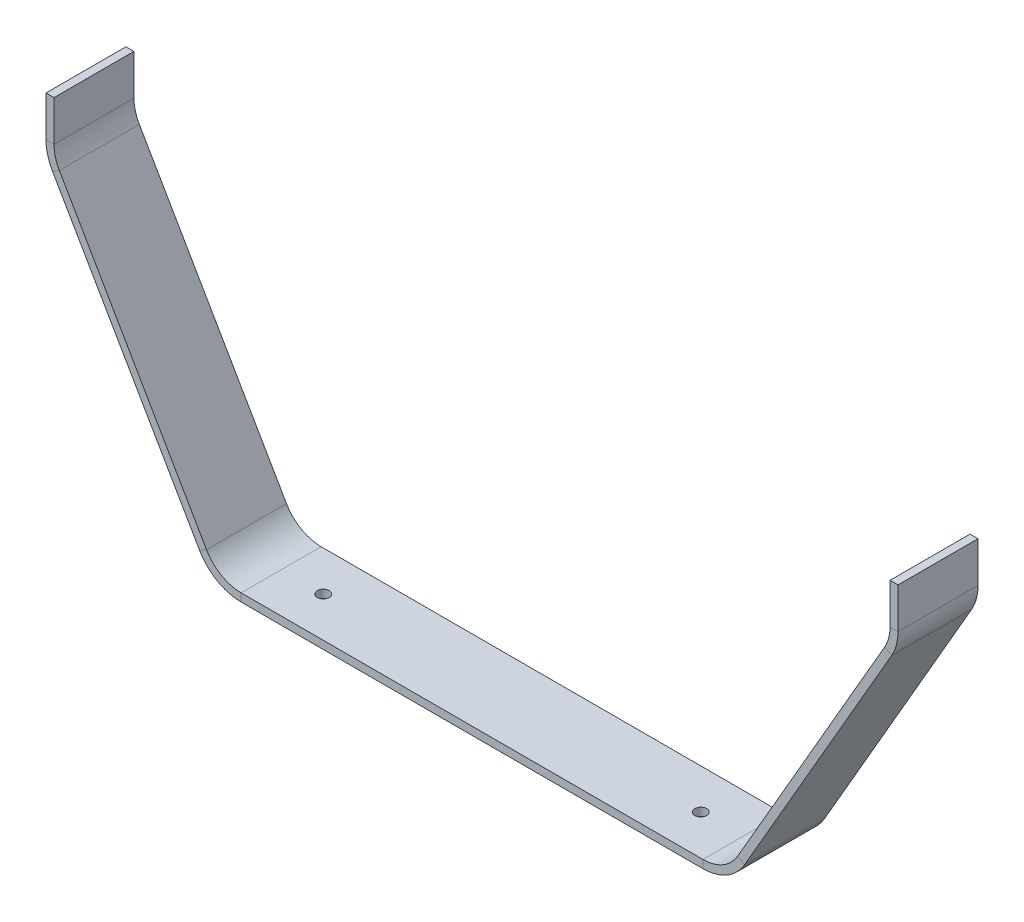
ISO-10303-21;
HEADER;
FILE_DESCRIPTION(('STEP AP214'),'2;1');
FILE_NAME('part.step','',(''),(''),'','','');
FILE_SCHEMA(('AUTOMOTIVE_DESIGN { 1 0 10303 214 1 1 1 1 }'));
ENDSEC;
DATA;
#1=APPLICATION_CONTEXT('core data for automotive mechanical design processes');
#2=APPLICATION_PROTOCOL_DEFINITION('international standard','automotive_design',2000,#1);
#3=PRODUCT_CONTEXT('',#1,'mechanical');
#4=PRODUCT('Part','Part','',(#3));
#5=PRODUCT_RELATED_PRODUCT_CATEGORY('part','',(#4));
#6=PRODUCT_DEFINITION_FORMATION('','',#4);
#7=PRODUCT_DEFINITION_CONTEXT('part definition',#1,'design');
#8=PRODUCT_DEFINITION('design','',#6,#7);
#9=PRODUCT_DEFINITION_SHAPE('','',#8);
#10=(LENGTH_UNIT() NAMED_UNIT(*) SI_UNIT(.MILLI.,.METRE.));
#11=(NAMED_UNIT(*) PLANE_ANGLE_UNIT() SI_UNIT($,.RADIAN.));
#12=(NAMED_UNIT(*) SI_UNIT($,.STERADIAN.) SOLID_ANGLE_UNIT());
#13=UNCERTAINTY_MEASURE_WITH_UNIT(LENGTH_MEASURE(1.E-05),#10,'distance_accuracy_value','');
#14=(GEOMETRIC_REPRESENTATION_CONTEXT(3) GLOBAL_UNCERTAINTY_ASSIGNED_CONTEXT((#13)) GLOBAL_UNIT_ASSIGNED_CONTEXT((#10,
#11,#12)) REPRESENTATION_CONTEXT('',''));
#15=CARTESIAN_POINT('',(0.,0.,0.));
#16=DIRECTION('',(0.,0.,1.));
#17=DIRECTION('',(1.,0.,0.));
#18=AXIS2_PLACEMENT_3D('',#15,#16,#17);
#19=CARTESIAN_POINT('',(33.5029250480415,-55.9805613919561,0.));
#20=DIRECTION('',(0.86602540378444,-0.499999999999998,0.));
#21=DIRECTION('',(0.,0.,-1.));
#22=AXIS2_PLACEMENT_3D('',#19,#20,#21);
#23=PLANE('',#22);
#24=DIRECTION('',(-0.499999999999998,-0.86602540378444,0.));
#25=VECTOR('',#24,1.);
#26=CARTESIAN_POINT('',(112.877925048041,81.5009714588238,-10.));
#27=LINE('',#26,#25);
#28=CARTESIAN_POINT('',(104.938028415146,67.7486670838041,-10.));
#29=VERTEX_POINT('',#28);
#30=CARTESIAN_POINT('',(68.132718313832,4.00000000000002,-10.));
#31=VERTEX_POINT('',#30);
#32=EDGE_CURVE('E56',#29,#31,#27,.T.);
#33=ORIENTED_EDGE('',*,*,#32,.F.);
#34=DIRECTION('',(0.,0.,1.));
#35=VECTOR('',#34,1.);
#36=CARTESIAN_POINT('',(104.938028415146,67.7486670838041,0.));
#37=LINE('',#36,#35);
#38=CARTESIAN_POINT('',(104.938028415146,67.7486670838041,9.99999999999997));
#39=VERTEX_POINT('',#38);
#40=EDGE_CURVE('E376',#29,#39,#37,.T.);
#41=ORIENTED_EDGE('',*,*,#40,.T.);
#42=DIRECTION('',(0.499999999999998,0.86602540378444,0.));
#43=VECTOR('',#42,1.);
#44=CARTESIAN_POINT('',(112.877925048041,81.5009714588238,9.99999999999998));
#45=LINE('',#44,#43);
#46=CARTESIAN_POINT('',(68.132718313832,4.00000000000005,9.99999999999999));
#47=VERTEX_POINT('',#46);
#48=EDGE_CURVE('E303',#47,#39,#45,.T.);
#49=ORIENTED_EDGE('',*,*,#48,.F.);
#50=DIRECTION('',(0.,0.,1.));
#51=VECTOR('',#50,1.);
#52=CARTESIAN_POINT('',(68.132718313832,4.,0.));
#53=LINE('',#52,#51);
#54=EDGE_CURVE('E274',#31,#47,#53,.T.);
#55=ORIENTED_EDGE('',*,*,#54,.F.);
#56=EDGE_LOOP('',(#33,#41,#49,#55));
#57=FACE_BOUND('',#56,.T.);
#58=ADVANCED_FACE('F52',(#57),#23,.T.);
#59=CARTESIAN_POINT('',(112.877925048041,81.5009714588238,-10.));
#60=DIRECTION('',(0.,0.,-1.));
#61=DIRECTION('',(-0.499999999999998,-0.86602540378444,0.));
#62=AXIS2_PLACEMENT_3D('',#59,#60,#61);
#63=PLANE('',#62);
#64=DIRECTION('',(-0.499999999999998,-0.86602540378444,0.));
#65=VECTOR('',#64,1.);
#66=CARTESIAN_POINT('',(111.145874240472,82.5009714588238,-10.));
#67=LINE('',#66,#65);
#68=CARTESIAN_POINT('',(103.205977607577,68.7486670838041,-10.));
#69=VERTEX_POINT('',#68);
#70=CARTESIAN_POINT('',(66.4006675062631,5.00000000000002,-10.));
#71=VERTEX_POINT('',#70);
#72=EDGE_CURVE('E283',#69,#71,#67,.T.);
#73=ORIENTED_EDGE('',*,*,#72,.F.);
#74=DIRECTION('',(0.86602540378444,-0.499999999999998,0.));
#75=VECTOR('',#74,1.);
#76=CARTESIAN_POINT('',(104.938028415146,67.7486670838041,-10.));
#77=LINE('',#76,#75);
#78=EDGE_CURVE('E383',#69,#29,#77,.T.);
#79=ORIENTED_EDGE('',*,*,#78,.T.);
#80=ORIENTED_EDGE('',*,*,#32,.T.);
#81=DIRECTION('',(0.86602540378444,-0.499999999999998,0.));
#82=VECTOR('',#81,1.);
#83=CARTESIAN_POINT('',(68.132718313832,4.,-10.));
#84=LINE('',#83,#82);
#85=EDGE_CURVE('E284',#71,#31,#84,.T.);
#86=ORIENTED_EDGE('',*,*,#85,.F.);
#87=EDGE_LOOP('',(#73,#79,#80,#86));
#88=FACE_BOUND('',#87,.T.);
#89=ADVANCED_FACE('F397',(#88),#63,.T.);
#90=CARTESIAN_POINT('',(112.877925048041,81.5009714588238,9.99999999999998));
#91=DIRECTION('',(0.,0.,1.));
#92=DIRECTION('',(0.499999999999998,0.86602540378444,0.));
#93=AXIS2_PLACEMENT_3D('',#90,#91,#92);
#94=PLANE('',#93);
#95=ORIENTED_EDGE('',*,*,#48,.T.);
#96=DIRECTION('',(-0.86602540378444,0.499999999999998,0.));
#97=VECTOR('',#96,1.);
#98=CARTESIAN_POINT('',(104.938028415146,67.7486670838041,9.99999999999998));
#99=LINE('',#98,#97);
#100=CARTESIAN_POINT('',(103.205977607577,68.7486670838041,9.99999999999998));
#101=VERTEX_POINT('',#100);
#102=EDGE_CURVE('E12',#39,#101,#99,.T.);
#103=ORIENTED_EDGE('',*,*,#102,.T.);
#104=DIRECTION('',(0.499999999999998,0.86602540378444,0.));
#105=VECTOR('',#104,1.);
#106=CARTESIAN_POINT('',(111.145874240472,82.5009714588238,9.99999999999998));
#107=LINE('',#106,#105);
#108=CARTESIAN_POINT('',(66.4006675062631,5.00000000000002,9.99999999999999));
#109=VERTEX_POINT('',#108);
#110=EDGE_CURVE('E282',#109,#101,#107,.T.);
#111=ORIENTED_EDGE('',*,*,#110,.F.);
#112=DIRECTION('',(-0.86602540378444,0.499999999999998,0.));
#113=VECTOR('',#112,1.);
#114=CARTESIAN_POINT('',(68.132718313832,4.,9.99999999999999));
#115=LINE('',#114,#113);
#116=EDGE_CURVE('E287',#47,#109,#115,.T.);
#117=ORIENTED_EDGE('',*,*,#116,.F.);
#118=EDGE_LOOP('',(#95,#103,#111,#117));
#119=FACE_BOUND('',#118,.T.);
#120=ADVANCED_FACE('F54',(#119),#94,.T.);
#121=CARTESIAN_POINT('',(-31.7708742404726,-54.980561391956,0.));
#122=DIRECTION('',(-0.86602540378444,-0.499999999999998,0.));
#123=DIRECTION('',(0.,0.,-1.));
#124=AXIS2_PLACEMENT_3D('',#121,#122,#123);
#125=PLANE('',#124);
#126=DIRECTION('',(-0.499999999999998,0.86602540378444,0.));
#127=VECTOR('',#126,1.);
#128=CARTESIAN_POINT('',(47.6041257595272,-192.462094242736,-10.));
#129=LINE('',#128,#127);
#130=CARTESIAN_POINT('',(-66.400667506263,5.00000000000002,-9.99999999999999));
#131=VERTEX_POINT('',#130);
#132=CARTESIAN_POINT('',(-103.205977607577,68.748667083804,-9.99999999999998));
#133=VERTEX_POINT('',#132);
#134=EDGE_CURVE('E77',#131,#133,#129,.T.);
#135=ORIENTED_EDGE('',*,*,#134,.T.);
#136=DIRECTION('',(0.,0.,1.));
#137=VECTOR('',#136,1.);
#138=CARTESIAN_POINT('',(-103.205977607577,68.748667083804,0.));
#139=LINE('',#138,#137);
#140=CARTESIAN_POINT('',(-103.205977607577,68.748667083804,10.));
#141=VERTEX_POINT('',#140);
#142=EDGE_CURVE('E371',#133,#141,#139,.T.);
#143=ORIENTED_EDGE('',*,*,#142,.T.);
#144=DIRECTION('',(0.499999999999998,-0.86602540378444,0.));
#145=VECTOR('',#144,1.);
#146=CARTESIAN_POINT('',(47.6041257595272,-192.462094242736,9.99999999999998));
#147=LINE('',#146,#145);
#148=CARTESIAN_POINT('',(-66.400667506263,5.00000000000002,10.));
#149=VERTEX_POINT('',#148);
#150=EDGE_CURVE('E308',#141,#149,#147,.T.);
#151=ORIENTED_EDGE('',*,*,#150,.T.);
#152=DIRECTION('',(0.,0.,1.));
#153=VECTOR('',#152,1.);
#154=CARTESIAN_POINT('',(-66.4006675062631,5.00000000000007,0.));
#155=LINE('',#154,#153);
#156=EDGE_CURVE('E299',#131,#149,#155,.T.);
#157=ORIENTED_EDGE('',*,*,#156,.F.);
#158=EDGE_LOOP('',(#135,#143,#151,#157));
#159=FACE_BOUND('',#158,.T.);
#160=ADVANCED_FACE('F431',(#159),#125,.F.);
#161=CARTESIAN_POINT('',(158.75,-2.,-10.));
#162=DIRECTION('',(0.,0.,-1.));
#163=DIRECTION('',(-1.,0.,0.));
#164=AXIS2_PLACEMENT_3D('',#161,#162,#163);
#165=PLANE('',#164);
#166=DIRECTION('',(-1.,0.,0.));
#167=VECTOR('',#166,1.);
#168=CARTESIAN_POINT('',(158.75,0.,-10.));
#169=LINE('',#168,#167);
#170=CARTESIAN_POINT('',(57.7404134684187,0.,-10.));
#171=VERTEX_POINT('',#170);
#172=CARTESIAN_POINT('',(-57.7404134684187,0.,-9.99999999999999));
#173=VERTEX_POINT('',#172);
#174=EDGE_CURVE('E360',#171,#173,#169,.T.);
#175=ORIENTED_EDGE('',*,*,#174,.F.);
#176=DIRECTION('',(0.,-1.,0.));
#177=VECTOR('',#176,1.);
#178=CARTESIAN_POINT('',(57.7404134684187,-2.,-10.));
#179=LINE('',#178,#177);
#180=CARTESIAN_POINT('',(57.7404134684187,-2.,-10.));
#181=VERTEX_POINT('',#180);
#182=EDGE_CURVE('E347',#171,#181,#179,.T.);
#183=ORIENTED_EDGE('',*,*,#182,.T.);
#184=DIRECTION('',(-1.,0.,0.));
#185=VECTOR('',#184,1.);
#186=CARTESIAN_POINT('',(158.75,-2.,-10.));
#187=LINE('',#186,#185);
#188=CARTESIAN_POINT('',(-57.7404134684187,-2.,-9.99999999999999));
#189=VERTEX_POINT('',#188);
#190=EDGE_CURVE('E335',#181,#189,#187,.T.);
#191=ORIENTED_EDGE('',*,*,#190,.T.);
#192=DIRECTION('',(0.,-1.,0.));
#193=VECTOR('',#192,1.);
#194=CARTESIAN_POINT('',(-57.7404134684187,-2.,-9.99999999999999));
#195=LINE('',#194,#193);
#196=EDGE_CURVE('E341',#173,#189,#195,.T.);
#197=ORIENTED_EDGE('',*,*,#196,.F.);
#198=EDGE_LOOP('',(#175,#183,#191,#197));
#199=FACE_BOUND('',#198,.T.);
#200=ADVANCED_FACE('F523',(#199),#165,.T.);
#201=CARTESIAN_POINT('',(158.75,-2.,9.99999999999998));
#202=DIRECTION('',(0.,0.,1.));
#203=DIRECTION('',(1.,0.,0.));
#204=AXIS2_PLACEMENT_3D('',#201,#202,#203);
#205=PLANE('',#204);
#206=DIRECTION('',(1.,0.,0.));
#207=VECTOR('',#206,1.);
#208=CARTESIAN_POINT('',(158.75,-2.,9.99999999999998));
#209=LINE('',#208,#207);
#210=CARTESIAN_POINT('',(-57.7404134684187,-2.,10.));
#211=VERTEX_POINT('',#210);
#212=CARTESIAN_POINT('',(57.7404134684187,-2.,9.99999999999999));
#213=VERTEX_POINT('',#212);
#214=EDGE_CURVE('E357',#211,#213,#209,.T.);
#215=ORIENTED_EDGE('',*,*,#214,.T.);
#216=DIRECTION('',(0.,1.,0.));
#217=VECTOR('',#216,1.);
#218=CARTESIAN_POINT('',(57.7404134684187,-2.,9.99999999999999));
#219=LINE('',#218,#217);
#220=CARTESIAN_POINT('',(57.7404134684187,0.,9.99999999999999));
#221=VERTEX_POINT('',#220);
#222=EDGE_CURVE('E353',#213,#221,#219,.T.);
#223=ORIENTED_EDGE('',*,*,#222,.T.);
#224=DIRECTION('',(1.,0.,0.));
#225=VECTOR('',#224,1.);
#226=CARTESIAN_POINT('',(158.75,0.,9.99999999999998));
#227=LINE('',#226,#225);
#228=CARTESIAN_POINT('',(-57.7404134684187,0.,10.));
#229=VERTEX_POINT('',#228);
#230=EDGE_CURVE('E325',#229,#221,#227,.T.);
#231=ORIENTED_EDGE('',*,*,#230,.F.);
#232=DIRECTION('',(0.,1.,0.));
#233=VECTOR('',#232,1.);
#234=CARTESIAN_POINT('',(-57.7404134684187,-2.,10.));
#235=LINE('',#234,#233);
#236=EDGE_CURVE('E334',#211,#229,#235,.T.);
#237=ORIENTED_EDGE('',*,*,#236,.F.);
#238=EDGE_LOOP('',(#215,#223,#231,#237));
#239=FACE_BOUND('',#238,.T.);
#240=ADVANCED_FACE('F413',(#239),#205,.T.);
#241=CARTESIAN_POINT('',(0.,-2.,0.));
#242=DIRECTION('',(0.,-1.,0.));
#243=DIRECTION('',(0.,0.,-1.));
#244=AXIS2_PLACEMENT_3D('',#241,#242,#243);
#245=PLANE('',#244);
#246=CARTESIAN_POINT('',(-47.215,-2.,0.));
#247=DIRECTION('',(0.,1.,0.));
#248=DIRECTION('',(0.,0.,1.));
#249=AXIS2_PLACEMENT_3D('',#246,#247,#248);
#250=CIRCLE('',#249,1.5);
#251=CARTESIAN_POINT('',(-47.215,-2.,1.50000000000001));
#252=VERTEX_POINT('',#251);
#253=EDGE_CURVE('E226',#252,#252,#250,.T.);
#254=ORIENTED_EDGE('',*,*,#253,.T.);
#255=EDGE_LOOP('',(#254));
#256=FACE_BOUND('',#255,.T.);
#257=CARTESIAN_POINT('',(47.215,-2.,0.));
#258=DIRECTION('',(0.,1.,0.));
#259=DIRECTION('',(0.,0.,-1.));
#260=AXIS2_PLACEMENT_3D('',#257,#258,#259);
#261=CIRCLE('',#260,1.5);
#262=CARTESIAN_POINT('',(47.215,-2.,-1.5));
#263=VERTEX_POINT('',#262);
#264=EDGE_CURVE('E912',#263,#263,#261,.T.);
#265=ORIENTED_EDGE('',*,*,#264,.T.);
#266=EDGE_LOOP('',(#265));
#267=FACE_BOUND('',#266,.T.);
#268=ORIENTED_EDGE('',*,*,#190,.F.);
#269=DIRECTION('',(0.,0.,1.));
#270=VECTOR('',#269,1.);
#271=CARTESIAN_POINT('',(57.7404134684187,-2.,0.));
#272=LINE('',#271,#270);
#273=EDGE_CURVE('E344',#181,#213,#272,.T.);
#274=ORIENTED_EDGE('',*,*,#273,.T.);
#275=ORIENTED_EDGE('',*,*,#214,.F.);
#276=DIRECTION('',(0.,0.,1.));
#277=VECTOR('',#276,1.);
#278=CARTESIAN_POINT('',(-57.7404134684187,-2.,0.));
#279=LINE('',#278,#277);
#280=EDGE_CURVE('E331',#189,#211,#279,.T.);
#281=ORIENTED_EDGE('',*,*,#280,.F.);
#282=EDGE_LOOP('',(#268,#274,#275,#281));
#283=FACE_BOUND('',#282,.T.);
#284=ADVANCED_FACE('F410',(#256,#267,#283),#245,.T.);
#285=CARTESIAN_POINT('',(0.,0.,0.));
#286=DIRECTION('',(0.,-1.,0.));
#287=DIRECTION('',(0.,0.,-1.));
#288=AXIS2_PLACEMENT_3D('',#285,#286,#287);
#289=PLANE('',#288);
#290=CARTESIAN_POINT('',(-47.215,0.,0.));
#291=DIRECTION('',(0.,1.,0.));
#292=DIRECTION('',(0.,0.,1.));
#293=AXIS2_PLACEMENT_3D('',#290,#291,#292);
#294=CIRCLE('',#293,1.5);
#295=CARTESIAN_POINT('',(-47.215,0.,1.50000000000001));
#296=VERTEX_POINT('',#295);
#297=EDGE_CURVE('E911',#296,#296,#294,.T.);
#298=ORIENTED_EDGE('',*,*,#297,.F.);
#299=EDGE_LOOP('',(#298));
#300=FACE_BOUND('',#299,.T.);
#301=CARTESIAN_POINT('',(47.215,0.,0.));
#302=DIRECTION('',(0.,1.,0.));
#303=DIRECTION('',(0.,0.,-1.));
#304=AXIS2_PLACEMENT_3D('',#301,#302,#303);
#305=CIRCLE('',#304,1.5);
#306=CARTESIAN_POINT('',(47.215,0.,-1.5));
#307=VERTEX_POINT('',#306);
#308=EDGE_CURVE('E916',#307,#307,#305,.T.);
#309=ORIENTED_EDGE('',*,*,#308,.F.);
#310=EDGE_LOOP('',(#309));
#311=FACE_BOUND('',#310,.T.);
#312=DIRECTION('',(0.,0.,1.));
#313=VECTOR('',#312,1.);
#314=CARTESIAN_POINT('',(57.7404134684187,0.,0.));
#315=LINE('',#314,#313);
#316=EDGE_CURVE('E350',#171,#221,#315,.T.);
#317=ORIENTED_EDGE('',*,*,#316,.F.);
#318=ORIENTED_EDGE('',*,*,#174,.T.);
#319=DIRECTION('',(0.,0.,1.));
#320=VECTOR('',#319,1.);
#321=CARTESIAN_POINT('',(-57.7404134684187,0.,0.));
#322=LINE('',#321,#320);
#323=EDGE_CURVE('E338',#173,#229,#322,.T.);
#324=ORIENTED_EDGE('',*,*,#323,.T.);
#325=ORIENTED_EDGE('',*,*,#230,.T.);
#326=EDGE_LOOP('',(#317,#318,#324,#325));
#327=FACE_BOUND('',#326,.T.);
#328=ADVANCED_FACE('F520',(#300,#311,#327),#289,.F.);
#329=CARTESIAN_POINT('',(-57.7404134684187,10.,-9.99999999999999));
#330=DIRECTION('',(0.,0.,-1.));
#331=DIRECTION('',(-1.,0.,0.));
#332=AXIS2_PLACEMENT_3D('',#329,#330,#331);
#333=PLANE('',#332);
#334=DIRECTION('',(-0.86602540378444,-0.499999999999998,0.));
#335=VECTOR('',#334,1.);
#336=CARTESIAN_POINT('',(-68.1327183138319,4.00000000000007,-9.99999999999999));
#337=LINE('',#336,#335);
#338=CARTESIAN_POINT('',(-68.132718313832,3.99999999999999,-9.99999999999999));
#339=VERTEX_POINT('',#338);
#340=EDGE_CURVE('E305',#131,#339,#337,.T.);
#341=ORIENTED_EDGE('',*,*,#340,.F.);
#342=CARTESIAN_POINT('',(-57.7404134684187,10.,-9.99999999999999));
#343=DIRECTION('',(0.,0.,-1.));
#344=DIRECTION('',(-1.,0.,0.));
#345=AXIS2_PLACEMENT_3D('',#342,#343,#344);
#346=CIRCLE('',#345,10.);
#347=EDGE_CURVE('E326',#131,#173,#346,.F.);
#348=ORIENTED_EDGE('',*,*,#347,.T.);
#349=ORIENTED_EDGE('',*,*,#196,.T.);
#350=CARTESIAN_POINT('',(-57.7404134684187,10.,-9.99999999999999));
#351=DIRECTION('',(0.,0.,1.));
#352=DIRECTION('',(-1.,0.,0.));
#353=AXIS2_PLACEMENT_3D('',#350,#351,#352);
#354=CIRCLE('',#353,12.);
#355=EDGE_CURVE('E318',#339,#189,#354,.T.);
#356=ORIENTED_EDGE('',*,*,#355,.F.);
#357=EDGE_LOOP('',(#341,#348,#349,#356));
#358=FACE_BOUND('',#357,.T.);
#359=ADVANCED_FACE('F433',(#358),#333,.T.);
#360=CARTESIAN_POINT('',(-57.7404134684187,10.,10.));
#361=DIRECTION('',(0.,0.,1.));
#362=DIRECTION('',(1.,0.,0.));
#363=AXIS2_PLACEMENT_3D('',#360,#361,#362);
#364=PLANE('',#363);
#365=CARTESIAN_POINT('',(-57.7404134684187,10.,10.));
#366=DIRECTION('',(0.,0.,-1.));
#367=DIRECTION('',(-1.,0.,0.));
#368=AXIS2_PLACEMENT_3D('',#365,#366,#367);
#369=CIRCLE('',#368,10.);
#370=EDGE_CURVE('E322',#229,#149,#369,.T.);
#371=ORIENTED_EDGE('',*,*,#370,.T.);
#372=DIRECTION('',(0.86602540378444,0.499999999999998,0.));
#373=VECTOR('',#372,1.);
#374=CARTESIAN_POINT('',(-68.1327183138319,4.00000000000007,10.));
#375=LINE('',#374,#373);
#376=CARTESIAN_POINT('',(-68.1327183138319,4.00000000000002,10.));
#377=VERTEX_POINT('',#376);
#378=EDGE_CURVE('E309',#377,#149,#375,.T.);
#379=ORIENTED_EDGE('',*,*,#378,.F.);
#380=CARTESIAN_POINT('',(-57.7404134684187,10.,10.));
#381=DIRECTION('',(0.,0.,-1.));
#382=DIRECTION('',(1.,0.,0.));
#383=AXIS2_PLACEMENT_3D('',#380,#381,#382);
#384=CIRCLE('',#383,12.);
#385=EDGE_CURVE('E321',#211,#377,#384,.T.);
#386=ORIENTED_EDGE('',*,*,#385,.F.);
#387=ORIENTED_EDGE('',*,*,#236,.T.);
#388=EDGE_LOOP('',(#371,#379,#386,#387));
#389=FACE_BOUND('',#388,.T.);
#390=ADVANCED_FACE('F422',(#389),#364,.T.);
#391=CARTESIAN_POINT('',(-57.7404134684187,10.,23.1665998381094));
#392=DIRECTION('',(0.,0.,-1.));
#393=DIRECTION('',(-1.,0.,0.));
#394=AXIS2_PLACEMENT_3D('',#391,#392,#393);
#395=CYLINDRICAL_SURFACE('',#394,12.);
#396=ORIENTED_EDGE('',*,*,#280,.T.);
#397=ORIENTED_EDGE('',*,*,#385,.T.);
#398=DIRECTION('',(0.,0.,1.));
#399=VECTOR('',#398,1.);
#400=CARTESIAN_POINT('',(-68.1327183138319,4.00000000000008,0.));
#401=LINE('',#400,#399);
#402=EDGE_CURVE('E313',#339,#377,#401,.T.);
#403=ORIENTED_EDGE('',*,*,#402,.F.);
#404=ORIENTED_EDGE('',*,*,#355,.T.);
#405=EDGE_LOOP('',(#396,#397,#403,#404));
#406=FACE_BOUND('',#405,.T.);
#407=ADVANCED_FACE('F418',(#406),#395,.T.);
#408=CARTESIAN_POINT('',(-57.7404134684187,10.,23.1665998381094));
#409=DIRECTION('',(0.,0.,-1.));
#410=DIRECTION('',(-1.,0.,0.));
#411=AXIS2_PLACEMENT_3D('',#408,#409,#410);
#412=CYLINDRICAL_SURFACE('',#411,10.);
#413=ORIENTED_EDGE('',*,*,#323,.F.);
#414=ORIENTED_EDGE('',*,*,#347,.F.);
#415=ORIENTED_EDGE('',*,*,#156,.T.);
#416=ORIENTED_EDGE('',*,*,#370,.F.);
#417=EDGE_LOOP('',(#413,#414,#415,#416));
#418=FACE_BOUND('',#417,.T.);
#419=ADVANCED_FACE('F429',(#418),#412,.F.);
#420=CARTESIAN_POINT('',(-33.5029250480414,-55.980561391956,0.));
#421=DIRECTION('',(-0.86602540378444,-0.499999999999998,0.));
#422=DIRECTION('',(0.,0.,-1.));
#423=AXIS2_PLACEMENT_3D('',#420,#421,#422);
#424=PLANE('',#423);
#425=DIRECTION('',(0.,0.,1.));
#426=VECTOR('',#425,1.);
#427=CARTESIAN_POINT('',(-104.938028415146,67.7486670838041,0.));
#428=LINE('',#427,#426);
#429=CARTESIAN_POINT('',(-104.938028415146,67.7486670838041,-9.99999999999998));
#430=VERTEX_POINT('',#429);
#431=CARTESIAN_POINT('',(-104.938028415146,67.748667083804,10.));
#432=VERTEX_POINT('',#431);
#433=EDGE_CURVE('E356',#430,#432,#428,.T.);
#434=ORIENTED_EDGE('',*,*,#433,.F.);
#435=DIRECTION('',(-0.499999999999998,0.86602540378444,0.));
#436=VECTOR('',#435,1.);
#437=CARTESIAN_POINT('',(45.8720749519583,-193.462094242736,-10.));
#438=LINE('',#437,#436);
#439=EDGE_CURVE('E307',#339,#430,#438,.T.);
#440=ORIENTED_EDGE('',*,*,#439,.F.);
#441=ORIENTED_EDGE('',*,*,#402,.T.);
#442=DIRECTION('',(0.499999999999998,-0.86602540378444,0.));
#443=VECTOR('',#442,1.);
#444=CARTESIAN_POINT('',(45.8720749519583,-193.462094242736,9.99999999999998));
#445=LINE('',#444,#443);
#446=EDGE_CURVE('E312',#432,#377,#445,.T.);
#447=ORIENTED_EDGE('',*,*,#446,.F.);
#448=EDGE_LOOP('',(#434,#440,#441,#447));
#449=FACE_BOUND('',#448,.T.);
#450=ADVANCED_FACE('F439',(#449),#424,.T.);
#451=CARTESIAN_POINT('',(45.8720749519583,-193.462094242736,9.99999999999998));
#452=DIRECTION('',(0.,0.,1.));
#453=DIRECTION('',(0.499999999999998,-0.86602540378444,0.));
#454=AXIS2_PLACEMENT_3D('',#451,#452,#453);
#455=PLANE('',#454);
#456=DIRECTION('',(0.86602540378444,0.499999999999998,0.));
#457=VECTOR('',#456,1.);
#458=CARTESIAN_POINT('',(-104.938028415146,67.748667083804,10.));
#459=LINE('',#458,#457);
#460=EDGE_CURVE('E368',#432,#141,#459,.T.);
#461=ORIENTED_EDGE('',*,*,#460,.F.);
#462=ORIENTED_EDGE('',*,*,#446,.T.);
#463=ORIENTED_EDGE('',*,*,#378,.T.);
#464=ORIENTED_EDGE('',*,*,#150,.F.);
#465=EDGE_LOOP('',(#461,#462,#463,#464));
#466=FACE_BOUND('',#465,.T.);
#467=ADVANCED_FACE('F425',(#466),#455,.T.);
#468=CARTESIAN_POINT('',(45.8720749519583,-193.462094242736,-10.));
#469=DIRECTION('',(0.,0.,-1.));
#470=DIRECTION('',(-0.499999999999998,0.86602540378444,0.));
#471=AXIS2_PLACEMENT_3D('',#468,#469,#470);
#472=PLANE('',#471);
#473=DIRECTION('',(-0.86602540378444,-0.499999999999998,0.));
#474=VECTOR('',#473,1.);
#475=CARTESIAN_POINT('',(-104.938028415146,67.748667083804,-9.99999999999998));
#476=LINE('',#475,#474);
#477=EDGE_CURVE('E373',#133,#430,#476,.T.);
#478=ORIENTED_EDGE('',*,*,#477,.F.);
#479=ORIENTED_EDGE('',*,*,#134,.F.);
#480=ORIENTED_EDGE('',*,*,#340,.T.);
#481=ORIENTED_EDGE('',*,*,#439,.T.);
#482=EDGE_LOOP('',(#478,#479,#480,#481));
#483=FACE_BOUND('',#482,.T.);
#484=ADVANCED_FACE('F436',(#483),#472,.T.);
#485=CARTESIAN_POINT('',(57.7404134684187,10.,-10.));
#486=DIRECTION('',(0.,0.,-1.));
#487=DIRECTION('',(-1.,0.,0.));
#488=AXIS2_PLACEMENT_3D('',#485,#486,#487);
#489=PLANE('',#488);
#490=ORIENTED_EDGE('',*,*,#182,.F.);
#491=CARTESIAN_POINT('',(57.7404134684187,10.,-10.));
#492=DIRECTION('',(0.,0.,1.));
#493=DIRECTION('',(1.,0.,0.));
#494=AXIS2_PLACEMENT_3D('',#491,#492,#493);
#495=CIRCLE('',#494,10.);
#496=EDGE_CURVE('E300',#171,#71,#495,.T.);
#497=ORIENTED_EDGE('',*,*,#496,.T.);
#498=ORIENTED_EDGE('',*,*,#85,.T.);
#499=CARTESIAN_POINT('',(57.7404134684187,10.,-10.));
#500=DIRECTION('',(0.,0.,1.));
#501=DIRECTION('',(-1.,0.,0.));
#502=AXIS2_PLACEMENT_3D('',#499,#500,#501);
#503=CIRCLE('',#502,12.);
#504=EDGE_CURVE('E292',#181,#31,#503,.T.);
#505=ORIENTED_EDGE('',*,*,#504,.F.);
#506=EDGE_LOOP('',(#490,#497,#498,#505));
#507=FACE_BOUND('',#506,.T.);
#508=ADVANCED_FACE('F405',(#507),#489,.T.);
#509=CARTESIAN_POINT('',(57.7404134684187,10.,9.99999999999999));
#510=DIRECTION('',(0.,0.,1.));
#511=DIRECTION('',(1.,0.,0.));
#512=AXIS2_PLACEMENT_3D('',#509,#510,#511);
#513=PLANE('',#512);
#514=CARTESIAN_POINT('',(57.7404134684187,10.,9.99999999999999));
#515=DIRECTION('',(0.,0.,1.));
#516=DIRECTION('',(1.,0.,0.));
#517=AXIS2_PLACEMENT_3D('',#514,#515,#516);
#518=CIRCLE('',#517,10.);
#519=EDGE_CURVE('E296',#109,#221,#518,.F.);
#520=ORIENTED_EDGE('',*,*,#519,.T.);
#521=ORIENTED_EDGE('',*,*,#222,.F.);
#522=CARTESIAN_POINT('',(57.7404134684187,10.,9.99999999999999));
#523=DIRECTION('',(0.,0.,-1.));
#524=DIRECTION('',(1.,0.,0.));
#525=AXIS2_PLACEMENT_3D('',#522,#523,#524);
#526=CIRCLE('',#525,12.);
#527=EDGE_CURVE('E295',#47,#213,#526,.T.);
#528=ORIENTED_EDGE('',*,*,#527,.F.);
#529=ORIENTED_EDGE('',*,*,#116,.T.);
#530=EDGE_LOOP('',(#520,#521,#528,#529));
#531=FACE_BOUND('',#530,.T.);
#532=ADVANCED_FACE('F516',(#531),#513,.T.);
#533=CARTESIAN_POINT('',(57.7404134684187,10.,-23.1665998381094));
#534=DIRECTION('',(0.,0.,1.));
#535=DIRECTION('',(1.,0.,0.));
#536=AXIS2_PLACEMENT_3D('',#533,#534,#535);
#537=CYLINDRICAL_SURFACE('',#536,12.);
#538=ORIENTED_EDGE('',*,*,#54,.T.);
#539=ORIENTED_EDGE('',*,*,#527,.T.);
#540=ORIENTED_EDGE('',*,*,#273,.F.);
#541=ORIENTED_EDGE('',*,*,#504,.T.);
#542=EDGE_LOOP('',(#538,#539,#540,#541));
#543=FACE_BOUND('',#542,.T.);
#544=ADVANCED_FACE('F408',(#543),#537,.T.);
#545=CARTESIAN_POINT('',(57.7404134684187,10.,-23.1665998381094));
#546=DIRECTION('',(0.,0.,1.));
#547=DIRECTION('',(1.,0.,0.));
#548=AXIS2_PLACEMENT_3D('',#545,#546,#547);
#549=CYLINDRICAL_SURFACE('',#548,10.);
#550=DIRECTION('',(0.,0.,1.));
#551=VECTOR('',#550,1.);
#552=CARTESIAN_POINT('',(66.4006675062631,4.99999999999999,0.));
#553=LINE('',#552,#551);
#554=EDGE_CURVE('E279',#71,#109,#553,.T.);
#555=ORIENTED_EDGE('',*,*,#554,.F.);
#556=ORIENTED_EDGE('',*,*,#496,.F.);
#557=ORIENTED_EDGE('',*,*,#316,.T.);
#558=ORIENTED_EDGE('',*,*,#519,.F.);
#559=EDGE_LOOP('',(#555,#556,#557,#558));
#560=FACE_BOUND('',#559,.T.);
#561=ADVANCED_FACE('F492',(#560),#549,.F.);
#562=CARTESIAN_POINT('',(31.7708742404726,-54.9805613919561,0.));
#563=DIRECTION('',(0.86602540378444,-0.499999999999998,0.));
#564=DIRECTION('',(0.,0.,-1.));
#565=AXIS2_PLACEMENT_3D('',#562,#563,#564);
#566=PLANE('',#565);
#567=DIRECTION('',(0.,0.,1.));
#568=VECTOR('',#567,1.);
#569=CARTESIAN_POINT('',(103.205977607577,68.7486670838041,0.));
#570=LINE('',#569,#568);
#571=EDGE_CURVE('E61',#69,#101,#570,.T.);
#572=ORIENTED_EDGE('',*,*,#571,.F.);
#573=ORIENTED_EDGE('',*,*,#72,.T.);
#574=ORIENTED_EDGE('',*,*,#554,.T.);
#575=ORIENTED_EDGE('',*,*,#110,.T.);
#576=EDGE_LOOP('',(#572,#573,#574,#575));
#577=FACE_BOUND('',#576,.T.);
#578=ADVANCED_FACE('F490',(#577),#566,.F.);
#579=CARTESIAN_POINT('',(-94.5457235697325,73.748667083804,-9.99999999999998));
#580=DIRECTION('',(0.,0.,-1.));
#581=DIRECTION('',(-1.,0.,0.));
#582=AXIS2_PLACEMENT_3D('',#579,#580,#581);
#583=PLANE('',#582);
#584=DIRECTION('',(-1.,0.,0.));
#585=VECTOR('',#584,1.);
#586=CARTESIAN_POINT('',(-106.545723569732,73.7486670838041,-9.99999999999998));
#587=LINE('',#586,#585);
#588=CARTESIAN_POINT('',(-104.545723569732,73.748667083804,-9.99999999999998));
#589=VERTEX_POINT('',#588);
#590=CARTESIAN_POINT('',(-106.545723569733,73.748667083804,-9.99999999999998));
#591=VERTEX_POINT('',#590);
#592=EDGE_CURVE('E243',#589,#591,#587,.T.);
#593=ORIENTED_EDGE('',*,*,#592,.F.);
#594=CARTESIAN_POINT('',(-94.5457235697325,73.748667083804,-9.99999999999998));
#595=DIRECTION('',(0.,0.,-1.));
#596=DIRECTION('',(-1.,0.,0.));
#597=AXIS2_PLACEMENT_3D('',#594,#595,#596);
#598=CIRCLE('',#597,10.);
#599=EDGE_CURVE('E240',#589,#133,#598,.F.);
#600=ORIENTED_EDGE('',*,*,#599,.T.);
#601=ORIENTED_EDGE('',*,*,#477,.T.);
#602=CARTESIAN_POINT('',(-94.5457235697325,73.748667083804,-9.99999999999998));
#603=DIRECTION('',(0.,0.,1.));
#604=DIRECTION('',(-1.,0.,0.));
#605=AXIS2_PLACEMENT_3D('',#602,#603,#604);
#606=CIRCLE('',#605,12.);
#607=EDGE_CURVE('E267',#591,#430,#606,.T.);
#608=ORIENTED_EDGE('',*,*,#607,.F.);
#609=EDGE_LOOP('',(#593,#600,#601,#608));
#610=FACE_BOUND('',#609,.T.);
#611=ADVANCED_FACE('F445',(#610),#583,.T.);
#612=CARTESIAN_POINT('',(-94.5457235697325,73.748667083804,10.));
#613=DIRECTION('',(0.,0.,1.));
#614=DIRECTION('',(1.,0.,0.));
#615=AXIS2_PLACEMENT_3D('',#612,#613,#614);
#616=PLANE('',#615);
#617=CARTESIAN_POINT('',(-94.5457235697325,73.748667083804,10.));
#618=DIRECTION('',(0.,0.,-1.));
#619=DIRECTION('',(-1.,0.,0.));
#620=AXIS2_PLACEMENT_3D('',#617,#618,#619);
#621=CIRCLE('',#620,10.);
#622=CARTESIAN_POINT('',(-104.545723569732,73.748667083804,10.));
#623=VERTEX_POINT('',#622);
#624=EDGE_CURVE('E271',#141,#623,#621,.T.);
#625=ORIENTED_EDGE('',*,*,#624,.T.);
#626=DIRECTION('',(1.,0.,0.));
#627=VECTOR('',#626,1.);
#628=CARTESIAN_POINT('',(-106.545723569732,73.7486670838041,10.));
#629=LINE('',#628,#627);
#630=CARTESIAN_POINT('',(-106.545723569732,73.748667083804,10.));
#631=VERTEX_POINT('',#630);
#632=EDGE_CURVE('E252',#631,#623,#629,.T.);
#633=ORIENTED_EDGE('',*,*,#632,.F.);
#634=CARTESIAN_POINT('',(-94.5457235697325,73.748667083804,10.));
#635=DIRECTION('',(0.,0.,-1.));
#636=DIRECTION('',(1.,0.,0.));
#637=AXIS2_PLACEMENT_3D('',#634,#635,#636);
#638=CIRCLE('',#637,12.);
#639=EDGE_CURVE('E270',#432,#631,#638,.T.);
#640=ORIENTED_EDGE('',*,*,#639,.F.);
#641=ORIENTED_EDGE('',*,*,#460,.T.);
#642=EDGE_LOOP('',(#625,#633,#640,#641));
#643=FACE_BOUND('',#642,.T.);
#644=ADVANCED_FACE('F460',(#643),#616,.T.);
#645=CARTESIAN_POINT('',(-94.5457235697325,73.748667083804,21.3804731009711));
#646=DIRECTION('',(0.,0.,-1.));
#647=DIRECTION('',(-1.,0.,0.));
#648=AXIS2_PLACEMENT_3D('',#645,#646,#647);
#649=CYLINDRICAL_SURFACE('',#648,12.);
#650=ORIENTED_EDGE('',*,*,#433,.T.);
#651=ORIENTED_EDGE('',*,*,#639,.T.);
#652=DIRECTION('',(0.,0.,1.));
#653=VECTOR('',#652,1.);
#654=CARTESIAN_POINT('',(-106.545723569732,73.7486670838041,0.));
#655=LINE('',#654,#653);
#656=EDGE_CURVE('E258',#591,#631,#655,.T.);
#657=ORIENTED_EDGE('',*,*,#656,.F.);
#658=ORIENTED_EDGE('',*,*,#607,.T.);
#659=EDGE_LOOP('',(#650,#651,#657,#658));
#660=FACE_BOUND('',#659,.T.);
#661=ADVANCED_FACE('F449',(#660),#649,.T.);
#662=CARTESIAN_POINT('',(-94.5457235697325,73.748667083804,21.3804731009711));
#663=DIRECTION('',(0.,0.,-1.));
#664=DIRECTION('',(-1.,0.,0.));
#665=AXIS2_PLACEMENT_3D('',#662,#663,#664);
#666=CYLINDRICAL_SURFACE('',#665,10.);
#667=ORIENTED_EDGE('',*,*,#142,.F.);
#668=ORIENTED_EDGE('',*,*,#599,.F.);
#669=DIRECTION('',(0.,0.,1.));
#670=VECTOR('',#669,1.);
#671=CARTESIAN_POINT('',(-104.545723569732,73.7486670838041,0.));
#672=LINE('',#671,#670);
#673=EDGE_CURVE('E233',#589,#623,#672,.T.);
#674=ORIENTED_EDGE('',*,*,#673,.T.);
#675=ORIENTED_EDGE('',*,*,#624,.F.);
#676=EDGE_LOOP('',(#667,#668,#674,#675));
#677=FACE_BOUND('',#676,.T.);
#678=ADVANCED_FACE('F463',(#677),#666,.F.);
#679=CARTESIAN_POINT('',(-106.545723569732,83.8688738180134,-9.99999999999998));
#680=DIRECTION('',(0.,1.,0.));
#681=DIRECTION('',(0.,0.,1.));
#682=AXIS2_PLACEMENT_3D('',#679,#680,#681);
#683=PLANE('',#682);
#684=DIRECTION('',(0.,0.,1.));
#685=VECTOR('',#684,1.);
#686=CARTESIAN_POINT('',(-104.545723569732,83.8688738180134,-9.99999999999998));
#687=LINE('',#686,#685);
#688=CARTESIAN_POINT('',(-104.545723569732,83.8688738180134,-9.99999999999998));
#689=VERTEX_POINT('',#688);
#690=CARTESIAN_POINT('',(-104.545723569732,83.8688738180134,10.));
#691=VERTEX_POINT('',#690);
#692=EDGE_CURVE('E247',#689,#691,#687,.T.);
#693=ORIENTED_EDGE('',*,*,#692,.F.);
#694=DIRECTION('',(1.,0.,0.));
#695=VECTOR('',#694,1.);
#696=CARTESIAN_POINT('',(-106.545723569732,83.8688738180134,-9.99999999999998));
#697=LINE('',#696,#695);
#698=CARTESIAN_POINT('',(-106.545723569732,83.8688738180134,-9.99999999999998));
#699=VERTEX_POINT('',#698);
#700=EDGE_CURVE('E237',#699,#689,#697,.T.);
#701=ORIENTED_EDGE('',*,*,#700,.F.);
#702=DIRECTION('',(0.,0.,1.));
#703=VECTOR('',#702,1.);
#704=CARTESIAN_POINT('',(-106.545723569732,83.8688738180134,-9.99999999999998));
#705=LINE('',#704,#703);
#706=CARTESIAN_POINT('',(-106.545723569732,83.8688738180134,10.));
#707=VERTEX_POINT('',#706);
#708=EDGE_CURVE('E262',#699,#707,#705,.T.);
#709=ORIENTED_EDGE('',*,*,#708,.T.);
#710=DIRECTION('',(1.,0.,0.));
#711=VECTOR('',#710,1.);
#712=CARTESIAN_POINT('',(-106.545723569732,83.8688738180134,10.));
#713=LINE('',#712,#711);
#714=EDGE_CURVE('E260',#707,#691,#713,.T.);
#715=ORIENTED_EDGE('',*,*,#714,.T.);
#716=EDGE_LOOP('',(#693,#701,#709,#715));
#717=FACE_BOUND('',#716,.T.);
#718=ADVANCED_FACE('F472',(#717),#683,.T.);
#719=CARTESIAN_POINT('',(-106.545723569733,-74.8811261819865,0.));
#720=DIRECTION('',(-1.,0.,0.));
#721=DIRECTION('',(0.,0.,-1.));
#722=AXIS2_PLACEMENT_3D('',#719,#720,#721);
#723=PLANE('',#722);
#724=DIRECTION('',(0.,1.,0.));
#725=VECTOR('',#724,1.);
#726=CARTESIAN_POINT('',(-106.545723569734,-233.631126181987,-10.));
#727=LINE('',#726,#725);
#728=EDGE_CURVE('E241',#591,#699,#727,.T.);
#729=ORIENTED_EDGE('',*,*,#728,.F.);
#730=ORIENTED_EDGE('',*,*,#656,.T.);
#731=DIRECTION('',(0.,-1.,0.));
#732=VECTOR('',#731,1.);
#733=CARTESIAN_POINT('',(-106.545723569734,-233.631126181987,9.99999999999998));
#734=LINE('',#733,#732);
#735=EDGE_CURVE('E255',#707,#631,#734,.T.);
#736=ORIENTED_EDGE('',*,*,#735,.F.);
#737=ORIENTED_EDGE('',*,*,#708,.F.);
#738=EDGE_LOOP('',(#729,#730,#736,#737));
#739=FACE_BOUND('',#738,.T.);
#740=ADVANCED_FACE('F453',(#739),#723,.T.);
#741=CARTESIAN_POINT('',(-106.545723569734,-233.631126181987,9.99999999999998));
#742=DIRECTION('',(0.,0.,1.));
#743=DIRECTION('',(0.,-1.,0.));
#744=AXIS2_PLACEMENT_3D('',#741,#742,#743);
#745=PLANE('',#744);
#746=ORIENTED_EDGE('',*,*,#735,.T.);
#747=ORIENTED_EDGE('',*,*,#632,.T.);
#748=DIRECTION('',(0.,-1.,0.));
#749=VECTOR('',#748,1.);
#750=CARTESIAN_POINT('',(-104.545723569734,-233.631126181987,9.99999999999998));
#751=LINE('',#750,#749);
#752=EDGE_CURVE('E245',#691,#623,#751,.T.);
#753=ORIENTED_EDGE('',*,*,#752,.F.);
#754=ORIENTED_EDGE('',*,*,#714,.F.);
#755=EDGE_LOOP('',(#746,#747,#753,#754));
#756=FACE_BOUND('',#755,.T.);
#757=ADVANCED_FACE('F457',(#756),#745,.T.);
#758=CARTESIAN_POINT('',(-104.545723569733,-74.8811261819866,0.));
#759=DIRECTION('',(-1.,0.,0.));
#760=DIRECTION('',(0.,0.,-1.));
#761=AXIS2_PLACEMENT_3D('',#758,#759,#760);
#762=PLANE('',#761);
#763=ORIENTED_EDGE('',*,*,#673,.F.);
#764=DIRECTION('',(0.,1.,0.));
#765=VECTOR('',#764,1.);
#766=CARTESIAN_POINT('',(-104.545723569734,-233.631126181987,-10.));
#767=LINE('',#766,#765);
#768=EDGE_CURVE('E250',#589,#689,#767,.T.);
#769=ORIENTED_EDGE('',*,*,#768,.T.);
#770=ORIENTED_EDGE('',*,*,#692,.T.);
#771=ORIENTED_EDGE('',*,*,#752,.T.);
#772=EDGE_LOOP('',(#763,#769,#770,#771));
#773=FACE_BOUND('',#772,.T.);
#774=ADVANCED_FACE('F466',(#773),#762,.F.);
#775=CARTESIAN_POINT('',(-106.545723569734,-233.631126181987,-10.));
#776=DIRECTION('',(0.,0.,-1.));
#777=DIRECTION('',(0.,1.,0.));
#778=AXIS2_PLACEMENT_3D('',#775,#776,#777);
#779=PLANE('',#778);
#780=ORIENTED_EDGE('',*,*,#768,.F.);
#781=ORIENTED_EDGE('',*,*,#592,.T.);
#782=ORIENTED_EDGE('',*,*,#728,.T.);
#783=ORIENTED_EDGE('',*,*,#700,.T.);
#784=EDGE_LOOP('',(#780,#781,#782,#783));
#785=FACE_BOUND('',#784,.T.);
#786=ADVANCED_FACE('F468',(#785),#779,.T.);
#787=CARTESIAN_POINT('',(94.5457235697327,73.7486670838041,-10.));
#788=DIRECTION('',(0.,0.,-1.));
#789=DIRECTION('',(-1.,0.,0.));
#790=AXIS2_PLACEMENT_3D('',#787,#788,#789);
#791=PLANE('',#790);
#792=ORIENTED_EDGE('',*,*,#78,.F.);
#793=CARTESIAN_POINT('',(94.5457235697327,73.7486670838041,-10.));
#794=DIRECTION('',(0.,0.,1.));
#795=DIRECTION('',(1.,0.,0.));
#796=AXIS2_PLACEMENT_3D('',#793,#794,#795);
#797=CIRCLE('',#796,10.);
#798=CARTESIAN_POINT('',(104.545723569733,73.7486670838041,-10.));
#799=VERTEX_POINT('',#798);
#800=EDGE_CURVE('E210',#69,#799,#797,.T.);
#801=ORIENTED_EDGE('',*,*,#800,.T.);
#802=DIRECTION('',(1.,0.,0.));
#803=VECTOR('',#802,1.);
#804=CARTESIAN_POINT('',(106.545723569733,73.7486670838041,-10.));
#805=LINE('',#804,#803);
#806=CARTESIAN_POINT('',(106.545723569733,73.7486670838041,-10.));
#807=VERTEX_POINT('',#806);
#808=EDGE_CURVE('E216',#799,#807,#805,.T.);
#809=ORIENTED_EDGE('',*,*,#808,.T.);
#810=CARTESIAN_POINT('',(94.5457235697327,73.7486670838041,-10.));
#811=DIRECTION('',(0.,0.,1.));
#812=DIRECTION('',(-1.,0.,0.));
#813=AXIS2_PLACEMENT_3D('',#810,#811,#812);
#814=CIRCLE('',#813,12.);
#815=EDGE_CURVE('E227',#29,#807,#814,.T.);
#816=ORIENTED_EDGE('',*,*,#815,.F.);
#817=EDGE_LOOP('',(#792,#801,#809,#816));
#818=FACE_BOUND('',#817,.T.);
#819=ADVANCED_FACE('F507',(#818),#791,.T.);
#820=CARTESIAN_POINT('',(94.5457235697327,73.7486670838041,9.99999999999997));
#821=DIRECTION('',(0.,0.,1.));
#822=DIRECTION('',(1.,0.,0.));
#823=AXIS2_PLACEMENT_3D('',#820,#821,#822);
#824=PLANE('',#823);
#825=CARTESIAN_POINT('',(94.5457235697327,73.7486670838041,9.99999999999995));
#826=DIRECTION('',(0.,0.,1.));
#827=DIRECTION('',(1.,0.,0.));
#828=AXIS2_PLACEMENT_3D('',#825,#826,#827);
#829=CIRCLE('',#828,10.);
#830=CARTESIAN_POINT('',(104.545723569733,73.7486670838041,9.99999999999998));
#831=VERTEX_POINT('',#830);
#832=EDGE_CURVE('E69',#831,#101,#829,.F.);
#833=ORIENTED_EDGE('',*,*,#832,.T.);
#834=ORIENTED_EDGE('',*,*,#102,.F.);
#835=CARTESIAN_POINT('',(94.5457235697327,73.7486670838041,9.99999999999997));
#836=DIRECTION('',(0.,0.,-1.));
#837=DIRECTION('',(1.,0.,0.));
#838=AXIS2_PLACEMENT_3D('',#835,#836,#837);
#839=CIRCLE('',#838,12.);
#840=CARTESIAN_POINT('',(106.545723569733,73.7486670838041,9.99999999999997));
#841=VERTEX_POINT('',#840);
#842=EDGE_CURVE('E230',#841,#39,#839,.T.);
#843=ORIENTED_EDGE('',*,*,#842,.F.);
#844=DIRECTION('',(-1.,0.,0.));
#845=VECTOR('',#844,1.);
#846=CARTESIAN_POINT('',(106.545723569733,73.7486670838041,9.99999999999998));
#847=LINE('',#846,#845);
#848=EDGE_CURVE('E198',#841,#831,#847,.T.);
#849=ORIENTED_EDGE('',*,*,#848,.T.);
#850=EDGE_LOOP('',(#833,#834,#843,#849));
#851=FACE_BOUND('',#850,.T.);
#852=ADVANCED_FACE('F701',(#851),#824,.T.);
#853=CARTESIAN_POINT('',(94.5457235697327,73.7486670838041,-21.3804731009711));
#854=DIRECTION('',(0.,0.,1.));
#855=DIRECTION('',(1.,0.,0.));
#856=AXIS2_PLACEMENT_3D('',#853,#854,#855);
#857=CYLINDRICAL_SURFACE('',#856,12.);
#858=DIRECTION('',(0.,0.,1.));
#859=VECTOR('',#858,1.);
#860=CARTESIAN_POINT('',(106.545723569733,73.7486670838041,0.));
#861=LINE('',#860,#859);
#862=EDGE_CURVE('E224',#807,#841,#861,.T.);
#863=ORIENTED_EDGE('',*,*,#862,.T.);
#864=ORIENTED_EDGE('',*,*,#842,.T.);
#865=ORIENTED_EDGE('',*,*,#40,.F.);
#866=ORIENTED_EDGE('',*,*,#815,.T.);
#867=EDGE_LOOP('',(#863,#864,#865,#866));
#868=FACE_BOUND('',#867,.T.);
#869=ADVANCED_FACE('F511',(#868),#857,.T.);
#870=CARTESIAN_POINT('',(94.5457235697327,73.7486670838041,-21.3804731009711));
#871=DIRECTION('',(0.,0.,1.));
#872=DIRECTION('',(1.,0.,0.));
#873=AXIS2_PLACEMENT_3D('',#870,#871,#872);
#874=CYLINDRICAL_SURFACE('',#873,10.);
#875=DIRECTION('',(0.,0.,1.));
#876=VECTOR('',#875,1.);
#877=CARTESIAN_POINT('',(104.545723569733,73.7486670838041,0.));
#878=LINE('',#877,#876);
#879=EDGE_CURVE('E505',#799,#831,#878,.T.);
#880=ORIENTED_EDGE('',*,*,#879,.F.);
#881=ORIENTED_EDGE('',*,*,#800,.F.);
#882=ORIENTED_EDGE('',*,*,#571,.T.);
#883=ORIENTED_EDGE('',*,*,#832,.F.);
#884=EDGE_LOOP('',(#880,#881,#882,#883));
#885=FACE_BOUND('',#884,.T.);
#886=ADVANCED_FACE('F503',(#885),#874,.F.);
#887=CARTESIAN_POINT('',(106.545723569733,83.8688738180134,-10.));
#888=DIRECTION('',(0.,1.,0.));
#889=DIRECTION('',(0.,0.,-1.));
#890=AXIS2_PLACEMENT_3D('',#887,#888,#889);
#891=PLANE('',#890);
#892=DIRECTION('',(0.,0.,-1.));
#893=VECTOR('',#892,1.);
#894=CARTESIAN_POINT('',(104.545723569733,83.8688738180134,-10.));
#895=LINE('',#894,#893);
#896=CARTESIAN_POINT('',(104.545723569733,83.8688738180134,9.99999999999998));
#897=VERTEX_POINT('',#896);
#898=CARTESIAN_POINT('',(104.545723569733,83.8688738180134,-10.));
#899=VERTEX_POINT('',#898);
#900=EDGE_CURVE('E202',#897,#899,#895,.T.);
#901=ORIENTED_EDGE('',*,*,#900,.F.);
#902=DIRECTION('',(-1.,0.,0.));
#903=VECTOR('',#902,1.);
#904=CARTESIAN_POINT('',(106.545723569733,83.8688738180134,9.99999999999998));
#905=LINE('',#904,#903);
#906=CARTESIAN_POINT('',(106.545723569733,83.8688738180134,9.99999999999998));
#907=VERTEX_POINT('',#906);
#908=EDGE_CURVE('E196',#907,#897,#905,.T.);
#909=ORIENTED_EDGE('',*,*,#908,.F.);
#910=DIRECTION('',(0.,0.,-1.));
#911=VECTOR('',#910,1.);
#912=CARTESIAN_POINT('',(106.545723569733,83.8688738180134,-10.));
#913=LINE('',#912,#911);
#914=CARTESIAN_POINT('',(106.545723569733,83.8688738180134,-10.));
#915=VERTEX_POINT('',#914);
#916=EDGE_CURVE('E207',#907,#915,#913,.T.);
#917=ORIENTED_EDGE('',*,*,#916,.T.);
#918=DIRECTION('',(-1.,0.,0.));
#919=VECTOR('',#918,1.);
#920=CARTESIAN_POINT('',(106.545723569733,83.8688738180134,-10.));
#921=LINE('',#920,#919);
#922=EDGE_CURVE('E215',#915,#899,#921,.T.);
#923=ORIENTED_EDGE('',*,*,#922,.T.);
#924=EDGE_LOOP('',(#901,#909,#917,#923));
#925=FACE_BOUND('',#924,.T.);
#926=ADVANCED_FACE('F206',(#925),#891,.T.);
#927=CARTESIAN_POINT('',(106.545723569733,-74.8811261819866,0.));
#928=DIRECTION('',(1.,0.,0.));
#929=DIRECTION('',(0.,0.,-1.));
#930=AXIS2_PLACEMENT_3D('',#927,#928,#929);
#931=PLANE('',#930);
#932=ORIENTED_EDGE('',*,*,#862,.F.);
#933=DIRECTION('',(0.,-1.,0.));
#934=VECTOR('',#933,1.);
#935=CARTESIAN_POINT('',(106.545723569733,83.8688738180134,-10.));
#936=LINE('',#935,#934);
#937=EDGE_CURVE('E214',#915,#807,#936,.T.);
#938=ORIENTED_EDGE('',*,*,#937,.F.);
#939=ORIENTED_EDGE('',*,*,#916,.F.);
#940=DIRECTION('',(0.,1.,0.));
#941=VECTOR('',#940,1.);
#942=CARTESIAN_POINT('',(106.545723569733,83.8688738180134,9.99999999999998));
#943=LINE('',#942,#941);
#944=EDGE_CURVE('E193',#841,#907,#943,.T.);
#945=ORIENTED_EDGE('',*,*,#944,.F.);
#946=EDGE_LOOP('',(#932,#938,#939,#945));
#947=FACE_BOUND('',#946,.T.);
#948=ADVANCED_FACE('F212',(#947),#931,.T.);
#949=CARTESIAN_POINT('',(106.545723569733,83.8688738180134,-10.));
#950=DIRECTION('',(0.,0.,-1.));
#951=DIRECTION('',(0.,-1.,0.));
#952=AXIS2_PLACEMENT_3D('',#949,#950,#951);
#953=PLANE('',#952);
#954=ORIENTED_EDGE('',*,*,#808,.F.);
#955=DIRECTION('',(0.,-1.,0.));
#956=VECTOR('',#955,1.);
#957=CARTESIAN_POINT('',(104.545723569733,83.8688738180134,-10.));
#958=LINE('',#957,#956);
#959=EDGE_CURVE('E925',#899,#799,#958,.T.);
#960=ORIENTED_EDGE('',*,*,#959,.F.);
#961=ORIENTED_EDGE('',*,*,#922,.F.);
#962=ORIENTED_EDGE('',*,*,#937,.T.);
#963=EDGE_LOOP('',(#954,#960,#961,#962));
#964=FACE_BOUND('',#963,.T.);
#965=ADVANCED_FACE('F747',(#964),#953,.T.);
#966=CARTESIAN_POINT('',(104.545723569733,-74.8811261819867,0.));
#967=DIRECTION('',(1.,0.,0.));
#968=DIRECTION('',(0.,0.,-1.));
#969=AXIS2_PLACEMENT_3D('',#966,#967,#968);
#970=PLANE('',#969);
#971=ORIENTED_EDGE('',*,*,#959,.T.);
#972=ORIENTED_EDGE('',*,*,#879,.T.);
#973=DIRECTION('',(0.,1.,0.));
#974=VECTOR('',#973,1.);
#975=CARTESIAN_POINT('',(104.545723569733,83.8688738180134,9.99999999999998));
#976=LINE('',#975,#974);
#977=EDGE_CURVE('E922',#831,#897,#976,.T.);
#978=ORIENTED_EDGE('',*,*,#977,.T.);
#979=ORIENTED_EDGE('',*,*,#900,.T.);
#980=EDGE_LOOP('',(#971,#972,#978,#979));
#981=FACE_BOUND('',#980,.T.);
#982=ADVANCED_FACE('F757',(#981),#970,.F.);
#983=CARTESIAN_POINT('',(106.545723569733,83.8688738180134,9.99999999999998));
#984=DIRECTION('',(0.,0.,1.));
#985=DIRECTION('',(0.,1.,0.));
#986=AXIS2_PLACEMENT_3D('',#983,#984,#985);
#987=PLANE('',#986);
#988=ORIENTED_EDGE('',*,*,#848,.F.);
#989=ORIENTED_EDGE('',*,*,#944,.T.);
#990=ORIENTED_EDGE('',*,*,#908,.T.);
#991=ORIENTED_EDGE('',*,*,#977,.F.);
#992=EDGE_LOOP('',(#988,#989,#990,#991));
#993=FACE_BOUND('',#992,.T.);
#994=ADVANCED_FACE('F195',(#993),#987,.T.);
#995=CARTESIAN_POINT('',(47.215,-2.,0.));
#996=DIRECTION('',(0.,1.,0.));
#997=DIRECTION('',(0.,0.,1.));
#998=AXIS2_PLACEMENT_3D('',#995,#996,#997);
#999=CYLINDRICAL_SURFACE('',#998,1.5);
#1000=ORIENTED_EDGE('',*,*,#264,.F.);
#1001=EDGE_LOOP('',(#1000));
#1002=FACE_BOUND('',#1001,.T.);
#1003=ORIENTED_EDGE('',*,*,#308,.T.);
#1004=EDGE_LOOP('',(#1003));
#1005=FACE_BOUND('',#1004,.T.);
#1006=ADVANCED_FACE('F777',(#1002,#1005),#999,.F.);
#1007=CARTESIAN_POINT('',(-47.215,-2.,0.));
#1008=DIRECTION('',(0.,1.,0.));
#1009=DIRECTION('',(0.,0.,1.));
#1010=AXIS2_PLACEMENT_3D('',#1007,#1008,#1009);
#1011=CYLINDRICAL_SURFACE('',#1010,1.5);
#1012=ORIENTED_EDGE('',*,*,#253,.F.);
#1013=EDGE_LOOP('',(#1012));
#1014=FACE_BOUND('',#1013,.T.);
#1015=ORIENTED_EDGE('',*,*,#297,.T.);
#1016=EDGE_LOOP('',(#1015));
#1017=FACE_BOUND('',#1016,.T.);
#1018=ADVANCED_FACE('F802',(#1014,#1017),#1011,.F.);
#1019=CLOSED_SHELL('',(#58,#89,#120,#160,#200,#240,#284,#328,#359,#390,#407,#419,#450,#467,#484,
#508,#532,#544,#561,#578,#611,#644,#661,#678,#718,#740,#757,#774,#786,#819,#852,#869,#886,#926,
#948,#965,#982,#994,#1006,#1018));
#1020=MANIFOLD_SOLID_BREP('B2',#1019);
#1021=ADVANCED_BREP_SHAPE_REPRESENTATION('',(#18,#1020),#14);
#1022=SHAPE_DEFINITION_REPRESENTATION(#9,#1021);
ENDSEC;
END-ISO-10303-21;
